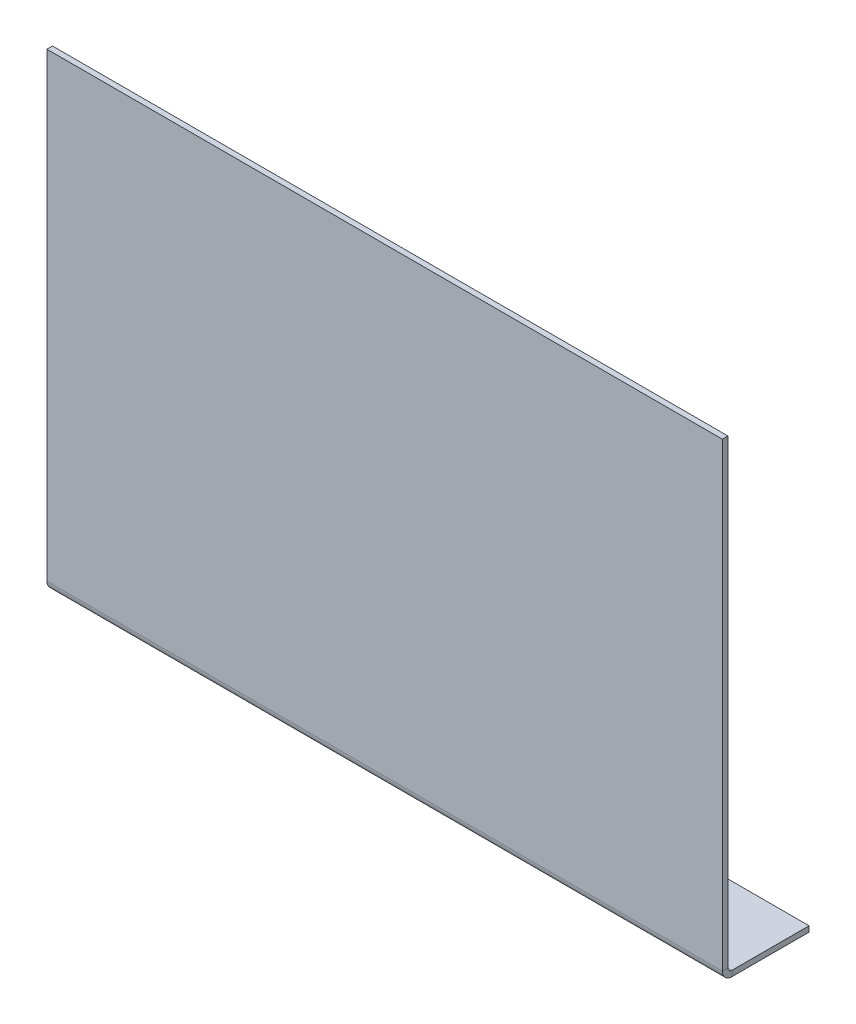
ISO-10303-21;
HEADER;
FILE_DESCRIPTION(('STEP AP214'),'2;1');
FILE_NAME('part.step','',(''),(''),'','','');
FILE_SCHEMA(('AUTOMOTIVE_DESIGN { 1 0 10303 214 1 1 1 1 }'));
ENDSEC;
DATA;
#1=APPLICATION_CONTEXT('core data for automotive mechanical design processes');
#2=APPLICATION_PROTOCOL_DEFINITION('international standard','automotive_design',2000,#1);
#3=PRODUCT_CONTEXT('',#1,'mechanical');
#4=PRODUCT('Part','Part','',(#3));
#5=PRODUCT_RELATED_PRODUCT_CATEGORY('part','',(#4));
#6=PRODUCT_DEFINITION_FORMATION('','',#4);
#7=PRODUCT_DEFINITION_CONTEXT('part definition',#1,'design');
#8=PRODUCT_DEFINITION('design','',#6,#7);
#9=PRODUCT_DEFINITION_SHAPE('','',#8);
#10=(LENGTH_UNIT() NAMED_UNIT(*) SI_UNIT(.MILLI.,.METRE.));
#11=(NAMED_UNIT(*) PLANE_ANGLE_UNIT() SI_UNIT($,.RADIAN.));
#12=(NAMED_UNIT(*) SI_UNIT($,.STERADIAN.) SOLID_ANGLE_UNIT());
#13=UNCERTAINTY_MEASURE_WITH_UNIT(LENGTH_MEASURE(1.E-05),#10,'distance_accuracy_value','');
#14=(GEOMETRIC_REPRESENTATION_CONTEXT(3) GLOBAL_UNCERTAINTY_ASSIGNED_CONTEXT((#13)) GLOBAL_UNIT_ASSIGNED_CONTEXT((#10,
#11,#12)) REPRESENTATION_CONTEXT('',''));
#15=CARTESIAN_POINT('',(0.,0.,0.));
#16=DIRECTION('',(0.,0.,1.));
#17=DIRECTION('',(1.,0.,0.));
#18=AXIS2_PLACEMENT_3D('',#15,#16,#17);
#19=CARTESIAN_POINT('',(0.,-15.2010083274639,15.8149916725362));
#20=DIRECTION('',(-1.,0.,0.));
#21=DIRECTION('',(0.,1.,0.));
#22=AXIS2_PLACEMENT_3D('',#19,#20,#21);
#23=PLANE('',#22);
#24=DIRECTION('',(0.,1.,0.));
#25=VECTOR('',#24,1.);
#26=CARTESIAN_POINT('',(0.,-15.2010083274639,14.7989916725362));
#27=LINE('',#26,#25);
#28=CARTESIAN_POINT('',(0.,0.736600000000002,14.7989916725361));
#29=VERTEX_POINT('',#28);
#30=CARTESIAN_POINT('',(0.,84.7989916725361,14.7989916725358));
#31=VERTEX_POINT('',#30);
#32=EDGE_CURVE('E84',#29,#31,#27,.T.);
#33=ORIENTED_EDGE('',*,*,#32,.F.);
#34=DIRECTION('',(0.,0.,1.));
#35=VECTOR('',#34,1.);
#36=CARTESIAN_POINT('',(0.,0.736600000000006,15.8149916725361));
#37=LINE('',#36,#35);
#38=CARTESIAN_POINT('',(0.,0.736600000000006,15.8149916725361));
#39=VERTEX_POINT('',#38);
#40=EDGE_CURVE('E138',#29,#39,#37,.T.);
#41=ORIENTED_EDGE('',*,*,#40,.T.);
#42=DIRECTION('',(0.,1.,0.));
#43=VECTOR('',#42,1.);
#44=CARTESIAN_POINT('',(0.,-15.2010083274639,15.8149916725362));
#45=LINE('',#44,#43);
#46=CARTESIAN_POINT('',(0.,84.7989916725361,15.8149916725358));
#47=VERTEX_POINT('',#46);
#48=EDGE_CURVE('E58',#39,#47,#45,.T.);
#49=ORIENTED_EDGE('',*,*,#48,.T.);
#50=DIRECTION('',(0.,0.,-1.));
#51=VECTOR('',#50,1.);
#52=CARTESIAN_POINT('',(0.,84.7989916725361,15.8149916725358));
#53=LINE('',#52,#51);
#54=EDGE_CURVE('E244',#47,#31,#53,.T.);
#55=ORIENTED_EDGE('',*,*,#54,.T.);
#56=EDGE_LOOP('',(#33,#41,#49,#55));
#57=FACE_BOUND('',#56,.T.);
#58=ADVANCED_FACE('F54',(#57),#23,.T.);
#59=CARTESIAN_POINT('',(123.25,-15.2010083274639,15.8149916725362));
#60=DIRECTION('',(1.,0.,0.));
#61=DIRECTION('',(0.,-1.,0.));
#62=AXIS2_PLACEMENT_3D('',#59,#60,#61);
#63=PLANE('',#62);
#64=DIRECTION('',(0.,-1.,0.));
#65=VECTOR('',#64,1.);
#66=CARTESIAN_POINT('',(123.25,-15.2010083274639,15.8149916725362));
#67=LINE('',#66,#65);
#68=CARTESIAN_POINT('',(123.25,84.7989916725361,15.8149916725358));
#69=VERTEX_POINT('',#68);
#70=CARTESIAN_POINT('',(123.25,0.736600000000006,15.8149916725361));
#71=VERTEX_POINT('',#70);
#72=EDGE_CURVE('E239',#69,#71,#67,.T.);
#73=ORIENTED_EDGE('',*,*,#72,.T.);
#74=DIRECTION('',(0.,0.,-1.));
#75=VECTOR('',#74,1.);
#76=CARTESIAN_POINT('',(123.25,0.736600000000006,15.8149916725361));
#77=LINE('',#76,#75);
#78=CARTESIAN_POINT('',(123.25,0.736600000000002,14.7989916725361));
#79=VERTEX_POINT('',#78);
#80=EDGE_CURVE('E12',#71,#79,#77,.T.);
#81=ORIENTED_EDGE('',*,*,#80,.T.);
#82=DIRECTION('',(0.,-1.,0.));
#83=VECTOR('',#82,1.);
#84=CARTESIAN_POINT('',(123.25,-15.2010083274639,14.7989916725362));
#85=LINE('',#84,#83);
#86=CARTESIAN_POINT('',(123.25,84.7989916725361,14.7989916725358));
#87=VERTEX_POINT('',#86);
#88=EDGE_CURVE('E75',#87,#79,#85,.T.);
#89=ORIENTED_EDGE('',*,*,#88,.F.);
#90=DIRECTION('',(0.,0.,-1.));
#91=VECTOR('',#90,1.);
#92=CARTESIAN_POINT('',(123.25,84.7989916725361,15.8149916725358));
#93=LINE('',#92,#91);
#94=EDGE_CURVE('E165',#69,#87,#93,.T.);
#95=ORIENTED_EDGE('',*,*,#94,.F.);
#96=EDGE_LOOP('',(#73,#81,#89,#95));
#97=FACE_BOUND('',#96,.T.);
#98=ADVANCED_FACE('F56',(#97),#63,.T.);
#99=CARTESIAN_POINT('',(0.,-15.2010083274639,14.7989916725362));
#100=DIRECTION('',(0.,0.,-1.));
#101=DIRECTION('',(0.,1.,0.));
#102=AXIS2_PLACEMENT_3D('',#99,#100,#101);
#103=PLANE('',#102);
#104=ORIENTED_EDGE('',*,*,#88,.T.);
#105=DIRECTION('',(-1.,0.,0.));
#106=VECTOR('',#105,1.);
#107=CARTESIAN_POINT('',(0.,0.736600000000002,14.7989916725361));
#108=LINE('',#107,#106);
#109=EDGE_CURVE('E63',#79,#29,#108,.T.);
#110=ORIENTED_EDGE('',*,*,#109,.T.);
#111=ORIENTED_EDGE('',*,*,#32,.T.);
#112=DIRECTION('',(1.,0.,0.));
#113=VECTOR('',#112,1.);
#114=CARTESIAN_POINT('',(0.,84.7989916725361,14.7989916725358));
#115=LINE('',#114,#113);
#116=EDGE_CURVE('E240',#31,#87,#115,.T.);
#117=ORIENTED_EDGE('',*,*,#116,.T.);
#118=EDGE_LOOP('',(#104,#110,#111,#117));
#119=FACE_BOUND('',#118,.T.);
#120=ADVANCED_FACE('F275',(#119),#103,.T.);
#121=CARTESIAN_POINT('',(0.,84.7989916725361,15.8149916725358));
#122=DIRECTION('',(0.,1.,0.));
#123=DIRECTION('',(1.,0.,0.));
#124=AXIS2_PLACEMENT_3D('',#121,#122,#123);
#125=PLANE('',#124);
#126=ORIENTED_EDGE('',*,*,#116,.F.);
#127=ORIENTED_EDGE('',*,*,#54,.F.);
#128=DIRECTION('',(1.,0.,0.));
#129=VECTOR('',#128,1.);
#130=CARTESIAN_POINT('',(0.,84.7989916725361,15.8149916725358));
#131=LINE('',#130,#129);
#132=EDGE_CURVE('E154',#47,#69,#131,.T.);
#133=ORIENTED_EDGE('',*,*,#132,.T.);
#134=ORIENTED_EDGE('',*,*,#94,.T.);
#135=EDGE_LOOP('',(#126,#127,#133,#134));
#136=FACE_BOUND('',#135,.T.);
#137=ADVANCED_FACE('F279',(#136),#125,.T.);
#138=CARTESIAN_POINT('',(0.,-15.2010083274639,15.8149916725362));
#139=DIRECTION('',(0.,0.,-1.));
#140=DIRECTION('',(0.,1.,0.));
#141=AXIS2_PLACEMENT_3D('',#138,#139,#140);
#142=PLANE('',#141);
#143=DIRECTION('',(-1.,0.,0.));
#144=VECTOR('',#143,1.);
#145=CARTESIAN_POINT('',(0.,0.736600000000006,15.8149916725361));
#146=LINE('',#145,#144);
#147=EDGE_CURVE('E145',#71,#39,#146,.T.);
#148=ORIENTED_EDGE('',*,*,#147,.F.);
#149=ORIENTED_EDGE('',*,*,#72,.F.);
#150=ORIENTED_EDGE('',*,*,#132,.F.);
#151=ORIENTED_EDGE('',*,*,#48,.F.);
#152=EDGE_LOOP('',(#148,#149,#150,#151));
#153=FACE_BOUND('',#152,.T.);
#154=ADVANCED_FACE('F150',(#153),#142,.F.);
#155=CARTESIAN_POINT('',(0.,-1.016,0.));
#156=DIRECTION('',(0.,0.,-1.));
#157=DIRECTION('',(-1.,0.,0.));
#158=AXIS2_PLACEMENT_3D('',#155,#156,#157);
#159=PLANE('',#158);
#160=DIRECTION('',(-1.,0.,0.));
#161=VECTOR('',#160,1.);
#162=CARTESIAN_POINT('',(0.,0.,0.));
#163=LINE('',#162,#161);
#164=CARTESIAN_POINT('',(123.25,0.,0.));
#165=VERTEX_POINT('',#164);
#166=CARTESIAN_POINT('',(0.,0.,0.));
#167=VERTEX_POINT('',#166);
#168=EDGE_CURVE('E198',#165,#167,#163,.T.);
#169=ORIENTED_EDGE('',*,*,#168,.F.);
#170=DIRECTION('',(0.,1.,0.));
#171=VECTOR('',#170,1.);
#172=CARTESIAN_POINT('',(123.25,-1.016,0.));
#173=LINE('',#172,#171);
#174=CARTESIAN_POINT('',(123.25,-1.016,0.));
#175=VERTEX_POINT('',#174);
#176=EDGE_CURVE('E189',#175,#165,#173,.T.);
#177=ORIENTED_EDGE('',*,*,#176,.F.);
#178=DIRECTION('',(-1.,0.,0.));
#179=VECTOR('',#178,1.);
#180=CARTESIAN_POINT('',(0.,-1.016,0.));
#181=LINE('',#180,#179);
#182=CARTESIAN_POINT('',(0.,-1.016,0.));
#183=VERTEX_POINT('',#182);
#184=EDGE_CURVE('E229',#175,#183,#181,.T.);
#185=ORIENTED_EDGE('',*,*,#184,.T.);
#186=DIRECTION('',(0.,1.,0.));
#187=VECTOR('',#186,1.);
#188=CARTESIAN_POINT('',(0.,-1.016,0.));
#189=LINE('',#188,#187);
#190=EDGE_CURVE('E227',#183,#167,#189,.T.);
#191=ORIENTED_EDGE('',*,*,#190,.T.);
#192=EDGE_LOOP('',(#169,#177,#185,#191));
#193=FACE_BOUND('',#192,.T.);
#194=ADVANCED_FACE('F304',(#193),#159,.T.);
#195=CARTESIAN_POINT('',(29.125,-1.016,7.));
#196=DIRECTION('',(0.,1.,0.));
#197=DIRECTION('',(0.,0.,1.));
#198=AXIS2_PLACEMENT_3D('',#195,#196,#197);
#199=CYLINDRICAL_SURFACE('',#198,1.4732);
#200=CARTESIAN_POINT('',(29.125,-1.016,7.));
#201=DIRECTION('',(0.,1.,0.));
#202=DIRECTION('',(0.,0.,1.));
#203=AXIS2_PLACEMENT_3D('',#200,#201,#202);
#204=CIRCLE('',#203,1.4732);
#205=CARTESIAN_POINT('',(29.125,-1.016,8.4732));
#206=VERTEX_POINT('',#205);
#207=EDGE_CURVE('E211',#206,#206,#204,.T.);
#208=ORIENTED_EDGE('',*,*,#207,.F.);
#209=EDGE_LOOP('',(#208));
#210=FACE_BOUND('',#209,.T.);
#211=CARTESIAN_POINT('',(29.125,0.,7.));
#212=DIRECTION('',(0.,1.,0.));
#213=DIRECTION('',(0.,0.,1.));
#214=AXIS2_PLACEMENT_3D('',#211,#212,#213);
#215=CIRCLE('',#214,1.4732);
#216=CARTESIAN_POINT('',(29.125,0.,8.4732));
#217=VERTEX_POINT('',#216);
#218=EDGE_CURVE('E223',#217,#217,#215,.T.);
#219=ORIENTED_EDGE('',*,*,#218,.T.);
#220=EDGE_LOOP('',(#219));
#221=FACE_BOUND('',#220,.T.);
#222=ADVANCED_FACE('F306',(#210,#221),#199,.F.);
#223=CARTESIAN_POINT('',(94.125,-1.016,7.));
#224=DIRECTION('',(0.,1.,0.));
#225=DIRECTION('',(0.,0.,1.));
#226=AXIS2_PLACEMENT_3D('',#223,#224,#225);
#227=CYLINDRICAL_SURFACE('',#226,1.4732);
#228=CARTESIAN_POINT('',(94.125,-1.016,7.));
#229=DIRECTION('',(0.,1.,0.));
#230=DIRECTION('',(0.,0.,1.));
#231=AXIS2_PLACEMENT_3D('',#228,#229,#230);
#232=CIRCLE('',#231,1.4732);
#233=CARTESIAN_POINT('',(94.125,-1.016,8.4732));
#234=VERTEX_POINT('',#233);
#235=EDGE_CURVE('E215',#234,#234,#232,.T.);
#236=ORIENTED_EDGE('',*,*,#235,.F.);
#237=EDGE_LOOP('',(#236));
#238=FACE_BOUND('',#237,.T.);
#239=CARTESIAN_POINT('',(94.125,0.,7.));
#240=DIRECTION('',(0.,1.,0.));
#241=DIRECTION('',(0.,0.,1.));
#242=AXIS2_PLACEMENT_3D('',#239,#240,#241);
#243=CIRCLE('',#242,1.4732);
#244=CARTESIAN_POINT('',(94.125,0.,8.4732));
#245=VERTEX_POINT('',#244);
#246=EDGE_CURVE('E219',#245,#245,#243,.T.);
#247=ORIENTED_EDGE('',*,*,#246,.T.);
#248=EDGE_LOOP('',(#247));
#249=FACE_BOUND('',#248,.T.);
#250=ADVANCED_FACE('F312',(#238,#249),#227,.F.);
#251=CARTESIAN_POINT('',(0.,-1.016,0.));
#252=DIRECTION('',(0.,1.,0.));
#253=DIRECTION('',(0.,0.,1.));
#254=AXIS2_PLACEMENT_3D('',#251,#252,#253);
#255=PLANE('',#254);
#256=ORIENTED_EDGE('',*,*,#235,.T.);
#257=EDGE_LOOP('',(#256));
#258=FACE_BOUND('',#257,.T.);
#259=ORIENTED_EDGE('',*,*,#207,.T.);
#260=EDGE_LOOP('',(#259));
#261=FACE_BOUND('',#260,.T.);
#262=DIRECTION('',(0.,0.,-1.));
#263=VECTOR('',#262,1.);
#264=CARTESIAN_POINT('',(123.25,-1.016,0.));
#265=LINE('',#264,#263);
#266=CARTESIAN_POINT('',(123.25,-1.016,14.0623916725361));
#267=VERTEX_POINT('',#266);
#268=EDGE_CURVE('E192',#267,#175,#265,.T.);
#269=ORIENTED_EDGE('',*,*,#268,.F.);
#270=DIRECTION('',(-1.,0.,0.));
#271=VECTOR('',#270,1.);
#272=CARTESIAN_POINT('',(0.,-1.016,14.0623916725361));
#273=LINE('',#272,#271);
#274=CARTESIAN_POINT('',(0.,-1.016,14.0623916725361));
#275=VERTEX_POINT('',#274);
#276=EDGE_CURVE('E207',#267,#275,#273,.T.);
#277=ORIENTED_EDGE('',*,*,#276,.T.);
#278=DIRECTION('',(0.,0.,1.));
#279=VECTOR('',#278,1.);
#280=CARTESIAN_POINT('',(0.,-1.016,0.));
#281=LINE('',#280,#279);
#282=EDGE_CURVE('E204',#183,#275,#281,.T.);
#283=ORIENTED_EDGE('',*,*,#282,.F.);
#284=ORIENTED_EDGE('',*,*,#184,.F.);
#285=EDGE_LOOP('',(#269,#277,#283,#284));
#286=FACE_BOUND('',#285,.T.);
#287=ADVANCED_FACE('F302',(#258,#261,#286),#255,.F.);
#288=CARTESIAN_POINT('',(0.,-1.016,0.));
#289=DIRECTION('',(-1.,0.,0.));
#290=DIRECTION('',(0.,0.,1.));
#291=AXIS2_PLACEMENT_3D('',#288,#289,#290);
#292=PLANE('',#291);
#293=DIRECTION('',(0.,-1.,0.));
#294=VECTOR('',#293,1.);
#295=CARTESIAN_POINT('',(0.,-1.016,14.0623916725361));
#296=LINE('',#295,#294);
#297=CARTESIAN_POINT('',(0.,0.,14.0623916725361));
#298=VERTEX_POINT('',#297);
#299=EDGE_CURVE('E170',#298,#275,#296,.T.);
#300=ORIENTED_EDGE('',*,*,#299,.F.);
#301=DIRECTION('',(0.,0.,1.));
#302=VECTOR('',#301,1.);
#303=CARTESIAN_POINT('',(0.,0.,0.));
#304=LINE('',#303,#302);
#305=EDGE_CURVE('E195',#167,#298,#304,.T.);
#306=ORIENTED_EDGE('',*,*,#305,.F.);
#307=ORIENTED_EDGE('',*,*,#190,.F.);
#308=ORIENTED_EDGE('',*,*,#282,.T.);
#309=EDGE_LOOP('',(#300,#306,#307,#308));
#310=FACE_BOUND('',#309,.T.);
#311=ADVANCED_FACE('F298',(#310),#292,.T.);
#312=CARTESIAN_POINT('',(0.,0.,0.));
#313=DIRECTION('',(0.,1.,0.));
#314=DIRECTION('',(0.,0.,1.));
#315=AXIS2_PLACEMENT_3D('',#312,#313,#314);
#316=PLANE('',#315);
#317=DIRECTION('',(-1.,0.,0.));
#318=VECTOR('',#317,1.);
#319=CARTESIAN_POINT('',(0.,0.,14.0623916725361));
#320=LINE('',#319,#318);
#321=CARTESIAN_POINT('',(123.25,0.,14.0623916725361));
#322=VERTEX_POINT('',#321);
#323=EDGE_CURVE('E178',#322,#298,#320,.T.);
#324=ORIENTED_EDGE('',*,*,#323,.F.);
#325=DIRECTION('',(0.,0.,-1.));
#326=VECTOR('',#325,1.);
#327=CARTESIAN_POINT('',(123.25,0.,0.));
#328=LINE('',#327,#326);
#329=EDGE_CURVE('E201',#322,#165,#328,.T.);
#330=ORIENTED_EDGE('',*,*,#329,.T.);
#331=ORIENTED_EDGE('',*,*,#168,.T.);
#332=ORIENTED_EDGE('',*,*,#305,.T.);
#333=EDGE_LOOP('',(#324,#330,#331,#332));
#334=FACE_BOUND('',#333,.T.);
#335=ORIENTED_EDGE('',*,*,#246,.F.);
#336=EDGE_LOOP('',(#335));
#337=FACE_BOUND('',#336,.T.);
#338=ORIENTED_EDGE('',*,*,#218,.F.);
#339=EDGE_LOOP('',(#338));
#340=FACE_BOUND('',#339,.T.);
#341=ADVANCED_FACE('F294',(#334,#337,#340),#316,.T.);
#342=CARTESIAN_POINT('',(123.25,-1.016,0.));
#343=DIRECTION('',(1.,0.,0.));
#344=DIRECTION('',(0.,0.,-1.));
#345=AXIS2_PLACEMENT_3D('',#342,#343,#344);
#346=PLANE('',#345);
#347=DIRECTION('',(0.,1.,0.));
#348=VECTOR('',#347,1.);
#349=CARTESIAN_POINT('',(123.25,-1.016,14.0623916725361));
#350=LINE('',#349,#348);
#351=EDGE_CURVE('E172',#267,#322,#350,.T.);
#352=ORIENTED_EDGE('',*,*,#351,.F.);
#353=ORIENTED_EDGE('',*,*,#268,.T.);
#354=ORIENTED_EDGE('',*,*,#176,.T.);
#355=ORIENTED_EDGE('',*,*,#329,.F.);
#356=EDGE_LOOP('',(#352,#353,#354,#355));
#357=FACE_BOUND('',#356,.T.);
#358=ADVANCED_FACE('F289',(#357),#346,.T.);
#359=CARTESIAN_POINT('',(123.25,0.7366,14.0623916725361));
#360=DIRECTION('',(1.,0.,0.));
#361=DIRECTION('',(0.,0.,-1.));
#362=AXIS2_PLACEMENT_3D('',#359,#360,#361);
#363=PLANE('',#362);
#364=ORIENTED_EDGE('',*,*,#351,.T.);
#365=CARTESIAN_POINT('',(123.25,0.7366,14.0623916725361));
#366=DIRECTION('',(-1.,0.,0.));
#367=DIRECTION('',(0.,0.,1.));
#368=AXIS2_PLACEMENT_3D('',#365,#366,#367);
#369=CIRCLE('',#368,0.7366);
#370=EDGE_CURVE('E185',#322,#79,#369,.T.);
#371=ORIENTED_EDGE('',*,*,#370,.T.);
#372=ORIENTED_EDGE('',*,*,#80,.F.);
#373=CARTESIAN_POINT('',(123.25,0.7366,14.0623916725361));
#374=DIRECTION('',(-1.,0.,0.));
#375=DIRECTION('',(0.,0.,-1.));
#376=AXIS2_PLACEMENT_3D('',#373,#374,#375);
#377=CIRCLE('',#376,1.7526);
#378=EDGE_CURVE('E163',#267,#71,#377,.T.);
#379=ORIENTED_EDGE('',*,*,#378,.F.);
#380=EDGE_LOOP('',(#364,#371,#372,#379));
#381=FACE_BOUND('',#380,.T.);
#382=ADVANCED_FACE('F286',(#381),#363,.T.);
#383=CARTESIAN_POINT('',(0.,0.7366,14.0623916725361));
#384=DIRECTION('',(-1.,0.,0.));
#385=DIRECTION('',(0.,0.,1.));
#386=AXIS2_PLACEMENT_3D('',#383,#384,#385);
#387=PLANE('',#386);
#388=ORIENTED_EDGE('',*,*,#40,.F.);
#389=CARTESIAN_POINT('',(0.,0.7366,14.0623916725361));
#390=DIRECTION('',(-1.,0.,0.));
#391=DIRECTION('',(0.,0.,1.));
#392=AXIS2_PLACEMENT_3D('',#389,#390,#391);
#393=CIRCLE('',#392,0.7366);
#394=EDGE_CURVE('E181',#29,#298,#393,.F.);
#395=ORIENTED_EDGE('',*,*,#394,.T.);
#396=ORIENTED_EDGE('',*,*,#299,.T.);
#397=CARTESIAN_POINT('',(0.,0.7366,14.0623916725361));
#398=DIRECTION('',(1.,0.,0.));
#399=DIRECTION('',(0.,0.,1.));
#400=AXIS2_PLACEMENT_3D('',#397,#398,#399);
#401=CIRCLE('',#400,1.7526);
#402=EDGE_CURVE('E161',#39,#275,#401,.T.);
#403=ORIENTED_EDGE('',*,*,#402,.F.);
#404=EDGE_LOOP('',(#388,#395,#396,#403));
#405=FACE_BOUND('',#404,.T.);
#406=ADVANCED_FACE('F168',(#405),#387,.T.);
#407=CARTESIAN_POINT('',(184.893451736456,0.7366,14.0623916725361));
#408=DIRECTION('',(-1.,0.,0.));
#409=DIRECTION('',(0.,0.,1.));
#410=AXIS2_PLACEMENT_3D('',#407,#408,#409);
#411=CYLINDRICAL_SURFACE('',#410,1.7526);
#412=ORIENTED_EDGE('',*,*,#402,.T.);
#413=ORIENTED_EDGE('',*,*,#276,.F.);
#414=ORIENTED_EDGE('',*,*,#378,.T.);
#415=ORIENTED_EDGE('',*,*,#147,.T.);
#416=EDGE_LOOP('',(#412,#413,#414,#415));
#417=FACE_BOUND('',#416,.T.);
#418=ADVANCED_FACE('F159',(#417),#411,.T.);
#419=CARTESIAN_POINT('',(184.893451736456,0.7366,14.0623916725361));
#420=DIRECTION('',(-1.,0.,0.));
#421=DIRECTION('',(0.,0.,1.));
#422=AXIS2_PLACEMENT_3D('',#419,#420,#421);
#423=CYLINDRICAL_SURFACE('',#422,0.7366);
#424=ORIENTED_EDGE('',*,*,#394,.F.);
#425=ORIENTED_EDGE('',*,*,#109,.F.);
#426=ORIENTED_EDGE('',*,*,#370,.F.);
#427=ORIENTED_EDGE('',*,*,#323,.T.);
#428=EDGE_LOOP('',(#424,#425,#426,#427));
#429=FACE_BOUND('',#428,.T.);
#430=ADVANCED_FACE('F285',(#429),#423,.F.);
#431=CLOSED_SHELL('',(#58,#98,#120,#137,#154,#194,#222,#250,#287,#311,#341,#358,#382,#406,#418,#430));
#432=MANIFOLD_SOLID_BREP('B2',#431);
#433=ADVANCED_BREP_SHAPE_REPRESENTATION('',(#18,#432),#14);
#434=SHAPE_DEFINITION_REPRESENTATION(#9,#433);
ENDSEC;
END-ISO-10303-21;
